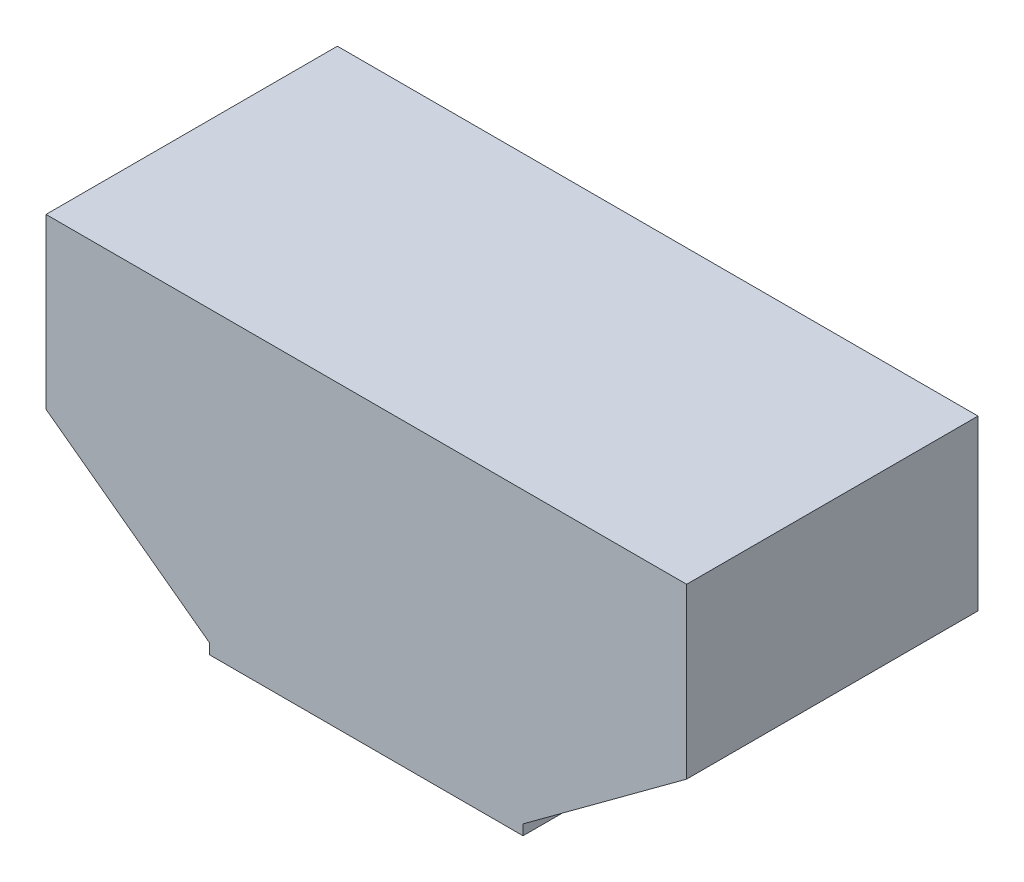
ISO-10303-21;
HEADER;
FILE_DESCRIPTION(('STEP AP214'),'2;1');
FILE_NAME('part.step','',(''),(''),'','','');
FILE_SCHEMA(('AUTOMOTIVE_DESIGN { 1 0 10303 214 1 1 1 1 }'));
ENDSEC;
DATA;
#1=APPLICATION_CONTEXT('core data for automotive mechanical design processes');
#2=APPLICATION_PROTOCOL_DEFINITION('international standard','automotive_design',2000,#1);
#3=PRODUCT_CONTEXT('',#1,'mechanical');
#4=PRODUCT('Part','Part','',(#3));
#5=PRODUCT_RELATED_PRODUCT_CATEGORY('part','',(#4));
#6=PRODUCT_DEFINITION_FORMATION('','',#4);
#7=PRODUCT_DEFINITION_CONTEXT('part definition',#1,'design');
#8=PRODUCT_DEFINITION('design','',#6,#7);
#9=PRODUCT_DEFINITION_SHAPE('','',#8);
#10=(LENGTH_UNIT() NAMED_UNIT(*) SI_UNIT(.MILLI.,.METRE.));
#11=(NAMED_UNIT(*) PLANE_ANGLE_UNIT() SI_UNIT($,.RADIAN.));
#12=(NAMED_UNIT(*) SI_UNIT($,.STERADIAN.) SOLID_ANGLE_UNIT());
#13=UNCERTAINTY_MEASURE_WITH_UNIT(LENGTH_MEASURE(1.E-05),#10,'distance_accuracy_value','');
#14=(GEOMETRIC_REPRESENTATION_CONTEXT(3) GLOBAL_UNCERTAINTY_ASSIGNED_CONTEXT((#13)) GLOBAL_UNIT_ASSIGNED_CONTEXT((#10,
#11,#12)) REPRESENTATION_CONTEXT('',''));
#15=CARTESIAN_POINT('',(0.,0.,0.));
#16=DIRECTION('',(0.,0.,1.));
#17=DIRECTION('',(1.,0.,0.));
#18=AXIS2_PLACEMENT_3D('',#15,#16,#17);
#19=CARTESIAN_POINT('',(-577.85,-2034.22364313589,1074.42));
#20=DIRECTION('',(1.,0.,0.));
#21=DIRECTION('',(0.,0.,-1.));
#22=AXIS2_PLACEMENT_3D('',#19,#20,#21);
#23=PLANE('',#22);
#24=DIRECTION('',(0.,-1.,0.));
#25=VECTOR('',#24,1.);
#26=CARTESIAN_POINT('',(-577.85,-2034.22364313589,0.));
#27=LINE('',#26,#25);
#28=CARTESIAN_POINT('',(-577.85,-2034.22364313589,0.));
#29=VERTEX_POINT('',#28);
#30=CARTESIAN_POINT('',(-577.85,-2072.32364313589,0.));
#31=VERTEX_POINT('',#30);
#32=EDGE_CURVE('E128',#29,#31,#27,.T.);
#33=ORIENTED_EDGE('',*,*,#32,.T.);
#34=DIRECTION('',(0.,0.,-1.));
#35=VECTOR('',#34,1.);
#36=CARTESIAN_POINT('',(-577.85,-2072.32364313589,1074.42));
#37=LINE('',#36,#35);
#38=CARTESIAN_POINT('',(-577.85,-2072.32364313589,1074.42));
#39=VERTEX_POINT('',#38);
#40=EDGE_CURVE('E11',#39,#31,#37,.T.);
#41=ORIENTED_EDGE('',*,*,#40,.F.);
#42=DIRECTION('',(0.,-1.,0.));
#43=VECTOR('',#42,1.);
#44=CARTESIAN_POINT('',(-577.85,-2034.22364313589,1074.42));
#45=LINE('',#44,#43);
#46=CARTESIAN_POINT('',(-577.85,-2034.22364313589,1074.42));
#47=VERTEX_POINT('',#46);
#48=EDGE_CURVE('E142',#47,#39,#45,.T.);
#49=ORIENTED_EDGE('',*,*,#48,.F.);
#50=DIRECTION('',(0.,0.,-1.));
#51=VECTOR('',#50,1.);
#52=CARTESIAN_POINT('',(-577.85,-2034.22364313589,1074.42));
#53=LINE('',#52,#51);
#54=EDGE_CURVE('E124',#47,#29,#53,.T.);
#55=ORIENTED_EDGE('',*,*,#54,.T.);
#56=EDGE_LOOP('',(#33,#41,#49,#55));
#57=FACE_BOUND('',#56,.T.);
#58=ADVANCED_FACE('F32',(#57),#23,.F.);
#59=CARTESIAN_POINT('',(-577.85,-2072.32364313589,1074.42));
#60=DIRECTION('',(0.,1.,0.));
#61=DIRECTION('',(0.,0.,1.));
#62=AXIS2_PLACEMENT_3D('',#59,#60,#61);
#63=PLANE('',#62);
#64=DIRECTION('',(1.,0.,0.));
#65=VECTOR('',#64,1.);
#66=CARTESIAN_POINT('',(-577.85,-2072.32364313589,0.));
#67=LINE('',#66,#65);
#68=CARTESIAN_POINT('',(577.85,-2072.32364313589,0.));
#69=VERTEX_POINT('',#68);
#70=EDGE_CURVE('E131',#31,#69,#67,.T.);
#71=ORIENTED_EDGE('',*,*,#70,.T.);
#72=DIRECTION('',(0.,0.,-1.));
#73=VECTOR('',#72,1.);
#74=CARTESIAN_POINT('',(577.85,-2072.32364313589,1074.42));
#75=LINE('',#74,#73);
#76=CARTESIAN_POINT('',(577.85,-2072.32364313589,1074.42));
#77=VERTEX_POINT('',#76);
#78=EDGE_CURVE('E40',#77,#69,#75,.T.);
#79=ORIENTED_EDGE('',*,*,#78,.F.);
#80=DIRECTION('',(1.,0.,0.));
#81=VECTOR('',#80,1.);
#82=CARTESIAN_POINT('',(-577.85,-2072.32364313589,1074.42));
#83=LINE('',#82,#81);
#84=EDGE_CURVE('E91',#39,#77,#83,.T.);
#85=ORIENTED_EDGE('',*,*,#84,.F.);
#86=ORIENTED_EDGE('',*,*,#40,.T.);
#87=EDGE_LOOP('',(#71,#79,#85,#86));
#88=FACE_BOUND('',#87,.T.);
#89=ADVANCED_FACE('F177',(#88),#63,.F.);
#90=CARTESIAN_POINT('',(577.85,-2072.32364313589,1074.42));
#91=DIRECTION('',(-1.,0.,0.));
#92=DIRECTION('',(0.,0.,1.));
#93=AXIS2_PLACEMENT_3D('',#90,#91,#92);
#94=PLANE('',#93);
#95=DIRECTION('',(0.,1.,0.));
#96=VECTOR('',#95,1.);
#97=CARTESIAN_POINT('',(577.85,-2072.32364313589,0.));
#98=LINE('',#97,#96);
#99=CARTESIAN_POINT('',(577.85,-2034.22364313589,0.));
#100=VERTEX_POINT('',#99);
#101=EDGE_CURVE('E133',#69,#100,#98,.T.);
#102=ORIENTED_EDGE('',*,*,#101,.T.);
#103=DIRECTION('',(0.,0.,-1.));
#104=VECTOR('',#103,1.);
#105=CARTESIAN_POINT('',(577.85,-2034.22364313589,1074.42));
#106=LINE('',#105,#104);
#107=CARTESIAN_POINT('',(577.85,-2034.22364313589,1074.42));
#108=VERTEX_POINT('',#107);
#109=EDGE_CURVE('E149',#108,#100,#106,.T.);
#110=ORIENTED_EDGE('',*,*,#109,.F.);
#111=DIRECTION('',(0.,1.,0.));
#112=VECTOR('',#111,1.);
#113=CARTESIAN_POINT('',(577.85,-2072.32364313589,1074.42));
#114=LINE('',#113,#112);
#115=EDGE_CURVE('E157',#77,#108,#114,.T.);
#116=ORIENTED_EDGE('',*,*,#115,.F.);
#117=ORIENTED_EDGE('',*,*,#78,.T.);
#118=EDGE_LOOP('',(#102,#110,#116,#117));
#119=FACE_BOUND('',#118,.T.);
#120=ADVANCED_FACE('F155',(#119),#94,.F.);
#121=CARTESIAN_POINT('',(1181.1,-1589.72364313589,1074.42));
#122=DIRECTION('',(-0.59319903804985,0.805055837353368,0.));
#123=DIRECTION('',(-0.805055837353368,-0.59319903804985,0.));
#124=AXIS2_PLACEMENT_3D('',#121,#122,#123);
#125=PLANE('',#124);
#126=DIRECTION('',(0.805055837353368,0.59319903804985,0.));
#127=VECTOR('',#126,1.);
#128=CARTESIAN_POINT('',(1181.1,-1589.72364313589,0.));
#129=LINE('',#128,#127);
#130=CARTESIAN_POINT('',(1181.1,-1589.72364313589,0.));
#131=VERTEX_POINT('',#130);
#132=EDGE_CURVE('E135',#100,#131,#129,.T.);
#133=ORIENTED_EDGE('',*,*,#132,.T.);
#134=DIRECTION('',(0.,0.,-1.));
#135=VECTOR('',#134,1.);
#136=CARTESIAN_POINT('',(1181.1,-1589.72364313589,1074.42));
#137=LINE('',#136,#135);
#138=CARTESIAN_POINT('',(1181.1,-1589.72364313589,1074.42));
#139=VERTEX_POINT('',#138);
#140=EDGE_CURVE('E146',#139,#131,#137,.T.);
#141=ORIENTED_EDGE('',*,*,#140,.F.);
#142=DIRECTION('',(0.805055837353368,0.59319903804985,0.));
#143=VECTOR('',#142,1.);
#144=CARTESIAN_POINT('',(1181.1,-1589.72364313589,1074.42));
#145=LINE('',#144,#143);
#146=EDGE_CURVE('E169',#108,#139,#145,.T.);
#147=ORIENTED_EDGE('',*,*,#146,.F.);
#148=ORIENTED_EDGE('',*,*,#109,.T.);
#149=EDGE_LOOP('',(#133,#141,#147,#148));
#150=FACE_BOUND('',#149,.T.);
#151=ADVANCED_FACE('F165',(#150),#125,.F.);
#152=CARTESIAN_POINT('',(1181.1,-967.423643135888,1074.42));
#153=DIRECTION('',(-1.,0.,0.));
#154=DIRECTION('',(0.,0.,1.));
#155=AXIS2_PLACEMENT_3D('',#152,#153,#154);
#156=PLANE('',#155);
#157=DIRECTION('',(0.,1.,0.));
#158=VECTOR('',#157,1.);
#159=CARTESIAN_POINT('',(1181.1,-967.423643135888,0.));
#160=LINE('',#159,#158);
#161=CARTESIAN_POINT('',(1181.1,-967.423643135888,0.));
#162=VERTEX_POINT('',#161);
#163=EDGE_CURVE('E137',#131,#162,#160,.T.);
#164=ORIENTED_EDGE('',*,*,#163,.T.);
#165=DIRECTION('',(0.,0.,-1.));
#166=VECTOR('',#165,1.);
#167=CARTESIAN_POINT('',(1181.1,-967.423643135888,1074.42));
#168=LINE('',#167,#166);
#169=CARTESIAN_POINT('',(1181.1,-967.423643135888,1074.42));
#170=VERTEX_POINT('',#169);
#171=EDGE_CURVE('E119',#170,#162,#168,.T.);
#172=ORIENTED_EDGE('',*,*,#171,.F.);
#173=DIRECTION('',(0.,1.,0.));
#174=VECTOR('',#173,1.);
#175=CARTESIAN_POINT('',(1181.1,-967.423643135888,1074.42));
#176=LINE('',#175,#174);
#177=EDGE_CURVE('E110',#139,#170,#176,.T.);
#178=ORIENTED_EDGE('',*,*,#177,.F.);
#179=ORIENTED_EDGE('',*,*,#140,.T.);
#180=EDGE_LOOP('',(#164,#172,#178,#179));
#181=FACE_BOUND('',#180,.T.);
#182=ADVANCED_FACE('F168',(#181),#156,.F.);
#183=CARTESIAN_POINT('',(-1181.1,-967.423643135888,1074.42));
#184=DIRECTION('',(0.,-1.,0.));
#185=DIRECTION('',(0.,0.,-1.));
#186=AXIS2_PLACEMENT_3D('',#183,#184,#185);
#187=PLANE('',#186);
#188=DIRECTION('',(-1.,0.,0.));
#189=VECTOR('',#188,1.);
#190=CARTESIAN_POINT('',(-1181.1,-967.423643135888,0.));
#191=LINE('',#190,#189);
#192=CARTESIAN_POINT('',(-1181.1,-967.423643135888,0.));
#193=VERTEX_POINT('',#192);
#194=EDGE_CURVE('E118',#162,#193,#191,.T.);
#195=ORIENTED_EDGE('',*,*,#194,.T.);
#196=DIRECTION('',(0.,0.,-1.));
#197=VECTOR('',#196,1.);
#198=CARTESIAN_POINT('',(-1181.1,-967.423643135888,1074.42));
#199=LINE('',#198,#197);
#200=CARTESIAN_POINT('',(-1181.1,-967.423643135888,1074.42));
#201=VERTEX_POINT('',#200);
#202=EDGE_CURVE('E115',#201,#193,#199,.T.);
#203=ORIENTED_EDGE('',*,*,#202,.F.);
#204=DIRECTION('',(-1.,0.,0.));
#205=VECTOR('',#204,1.);
#206=CARTESIAN_POINT('',(-1181.1,-967.423643135888,1074.42));
#207=LINE('',#206,#205);
#208=EDGE_CURVE('E104',#170,#201,#207,.T.);
#209=ORIENTED_EDGE('',*,*,#208,.F.);
#210=ORIENTED_EDGE('',*,*,#171,.T.);
#211=EDGE_LOOP('',(#195,#203,#209,#210));
#212=FACE_BOUND('',#211,.T.);
#213=ADVANCED_FACE('F116',(#212),#187,.F.);
#214=CARTESIAN_POINT('',(-1181.1,-1589.72364313589,1074.42));
#215=DIRECTION('',(1.,0.,0.));
#216=DIRECTION('',(0.,0.,-1.));
#217=AXIS2_PLACEMENT_3D('',#214,#215,#216);
#218=PLANE('',#217);
#219=DIRECTION('',(0.,-1.,0.));
#220=VECTOR('',#219,1.);
#221=CARTESIAN_POINT('',(-1181.1,-1589.72364313589,0.));
#222=LINE('',#221,#220);
#223=CARTESIAN_POINT('',(-1181.1,-1589.72364313589,0.));
#224=VERTEX_POINT('',#223);
#225=EDGE_CURVE('E77',#193,#224,#222,.T.);
#226=ORIENTED_EDGE('',*,*,#225,.T.);
#227=DIRECTION('',(0.,0.,-1.));
#228=VECTOR('',#227,1.);
#229=CARTESIAN_POINT('',(-1181.1,-1589.72364313589,1074.42));
#230=LINE('',#229,#228);
#231=CARTESIAN_POINT('',(-1181.1,-1589.72364313589,1074.42));
#232=VERTEX_POINT('',#231);
#233=EDGE_CURVE('E120',#232,#224,#230,.T.);
#234=ORIENTED_EDGE('',*,*,#233,.F.);
#235=DIRECTION('',(0.,-1.,0.));
#236=VECTOR('',#235,1.);
#237=CARTESIAN_POINT('',(-1181.1,-1589.72364313589,1074.42));
#238=LINE('',#237,#236);
#239=EDGE_CURVE('E108',#201,#232,#238,.T.);
#240=ORIENTED_EDGE('',*,*,#239,.F.);
#241=ORIENTED_EDGE('',*,*,#202,.T.);
#242=EDGE_LOOP('',(#226,#234,#240,#241));
#243=FACE_BOUND('',#242,.T.);
#244=ADVANCED_FACE('F122',(#243),#218,.F.);
#245=CARTESIAN_POINT('',(-577.85,-2034.22364313589,1074.42));
#246=DIRECTION('',(0.59319903804985,0.805055837353368,0.));
#247=DIRECTION('',(-0.805055837353368,0.59319903804985,0.));
#248=AXIS2_PLACEMENT_3D('',#245,#246,#247);
#249=PLANE('',#248);
#250=DIRECTION('',(0.805055837353368,-0.59319903804985,0.));
#251=VECTOR('',#250,1.);
#252=CARTESIAN_POINT('',(-577.85,-2034.22364313589,0.));
#253=LINE('',#252,#251);
#254=EDGE_CURVE('E83',#224,#29,#253,.T.);
#255=ORIENTED_EDGE('',*,*,#254,.T.);
#256=ORIENTED_EDGE('',*,*,#54,.F.);
#257=DIRECTION('',(0.805055837353368,-0.59319903804985,0.));
#258=VECTOR('',#257,1.);
#259=CARTESIAN_POINT('',(-577.85,-2034.22364313589,1074.42));
#260=LINE('',#259,#258);
#261=EDGE_CURVE('E48',#232,#47,#260,.T.);
#262=ORIENTED_EDGE('',*,*,#261,.F.);
#263=ORIENTED_EDGE('',*,*,#233,.T.);
#264=EDGE_LOOP('',(#255,#256,#262,#263));
#265=FACE_BOUND('',#264,.T.);
#266=ADVANCED_FACE('F193',(#265),#249,.F.);
#267=CARTESIAN_POINT('',(0.,0.,1074.42));
#268=DIRECTION('',(0.,0.,1.));
#269=DIRECTION('',(1.,0.,0.));
#270=AXIS2_PLACEMENT_3D('',#267,#268,#269);
#271=PLANE('',#270);
#272=ORIENTED_EDGE('',*,*,#48,.T.);
#273=ORIENTED_EDGE('',*,*,#84,.T.);
#274=ORIENTED_EDGE('',*,*,#115,.T.);
#275=ORIENTED_EDGE('',*,*,#146,.T.);
#276=ORIENTED_EDGE('',*,*,#177,.T.);
#277=ORIENTED_EDGE('',*,*,#208,.T.);
#278=ORIENTED_EDGE('',*,*,#239,.T.);
#279=ORIENTED_EDGE('',*,*,#261,.T.);
#280=EDGE_LOOP('',(#272,#273,#274,#275,#276,#277,#278,#279));
#281=FACE_BOUND('',#280,.T.);
#282=ADVANCED_FACE('F106',(#281),#271,.T.);
#283=CARTESIAN_POINT('',(0.,0.,0.));
#284=DIRECTION('',(0.,0.,1.));
#285=DIRECTION('',(1.,0.,0.));
#286=AXIS2_PLACEMENT_3D('',#283,#284,#285);
#287=PLANE('',#286);
#288=ORIENTED_EDGE('',*,*,#32,.F.);
#289=ORIENTED_EDGE('',*,*,#254,.F.);
#290=ORIENTED_EDGE('',*,*,#225,.F.);
#291=ORIENTED_EDGE('',*,*,#194,.F.);
#292=ORIENTED_EDGE('',*,*,#163,.F.);
#293=ORIENTED_EDGE('',*,*,#132,.F.);
#294=ORIENTED_EDGE('',*,*,#101,.F.);
#295=ORIENTED_EDGE('',*,*,#70,.F.);
#296=EDGE_LOOP('',(#288,#289,#290,#291,#292,#293,#294,#295));
#297=FACE_BOUND('',#296,.T.);
#298=ADVANCED_FACE('F161',(#297),#287,.F.);
#299=CLOSED_SHELL('',(#58,#89,#120,#151,#182,#213,#244,#266,#282,#298));
#300=MANIFOLD_SOLID_BREP('B2',#299);
#301=ADVANCED_BREP_SHAPE_REPRESENTATION('',(#18,#300),#14);
#302=SHAPE_DEFINITION_REPRESENTATION(#9,#301);
ENDSEC;
END-ISO-10303-21;
